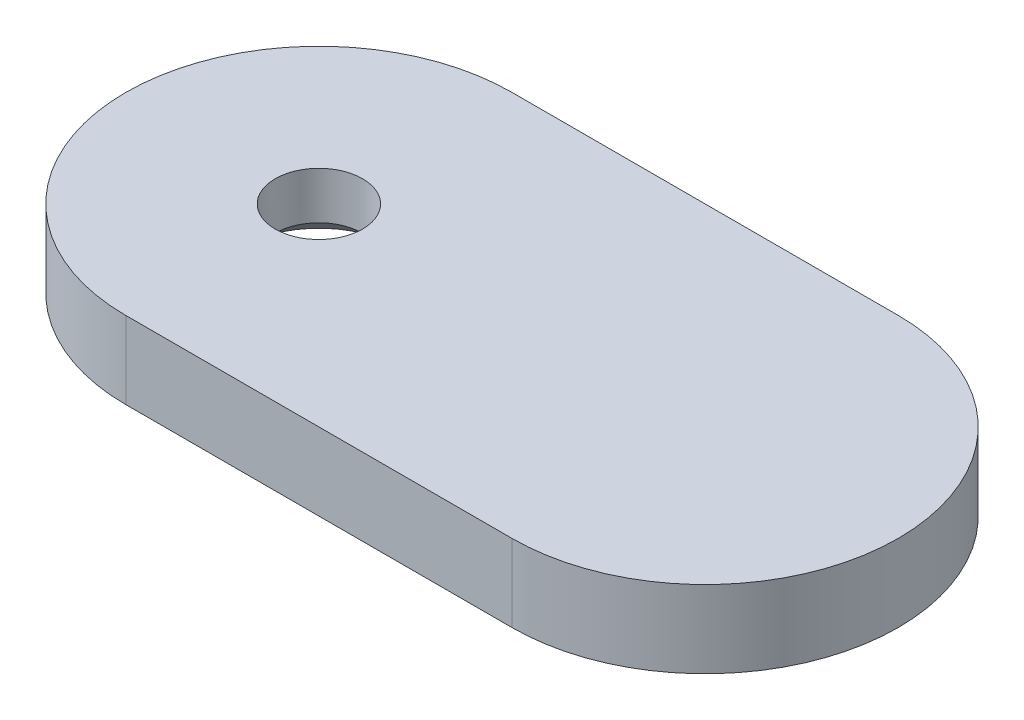
ISO-10303-21;
HEADER;
FILE_DESCRIPTION(('STEP AP214'),'2;1');
FILE_NAME('part.step','',(''),(''),'','','');
FILE_SCHEMA(('AUTOMOTIVE_DESIGN { 1 0 10303 214 1 1 1 1 }'));
ENDSEC;
DATA;
#1=APPLICATION_CONTEXT('core data for automotive mechanical design processes');
#2=APPLICATION_PROTOCOL_DEFINITION('international standard','automotive_design',2000,#1);
#3=PRODUCT_CONTEXT('',#1,'mechanical');
#4=PRODUCT('Part','Part','',(#3));
#5=PRODUCT_RELATED_PRODUCT_CATEGORY('part','',(#4));
#6=PRODUCT_DEFINITION_FORMATION('','',#4);
#7=PRODUCT_DEFINITION_CONTEXT('part definition',#1,'design');
#8=PRODUCT_DEFINITION('design','',#6,#7);
#9=PRODUCT_DEFINITION_SHAPE('','',#8);
#10=(LENGTH_UNIT() NAMED_UNIT(*) SI_UNIT(.MILLI.,.METRE.));
#11=(NAMED_UNIT(*) PLANE_ANGLE_UNIT() SI_UNIT($,.RADIAN.));
#12=(NAMED_UNIT(*) SI_UNIT($,.STERADIAN.) SOLID_ANGLE_UNIT());
#13=UNCERTAINTY_MEASURE_WITH_UNIT(LENGTH_MEASURE(1.E-05),#10,'distance_accuracy_value','');
#14=(GEOMETRIC_REPRESENTATION_CONTEXT(3) GLOBAL_UNCERTAINTY_ASSIGNED_CONTEXT((#13)) GLOBAL_UNIT_ASSIGNED_CONTEXT((#10,
#11,#12)) REPRESENTATION_CONTEXT('',''));
#15=CARTESIAN_POINT('',(0.,0.,0.));
#16=DIRECTION('',(0.,0.,1.));
#17=DIRECTION('',(1.,0.,0.));
#18=AXIS2_PLACEMENT_3D('',#15,#16,#17);
#19=CARTESIAN_POINT('',(-6.92075426384892,2.,0.));
#20=DIRECTION('',(0.,-1.,0.));
#21=DIRECTION('',(0.,0.,-1.));
#22=AXIS2_PLACEMENT_3D('',#19,#20,#21);
#23=CYLINDRICAL_SURFACE('',#22,5.);
#24=CARTESIAN_POINT('',(-6.92075426384892,0.,0.));
#25=DIRECTION('',(0.,1.,0.));
#26=DIRECTION('',(0.,0.,1.));
#27=AXIS2_PLACEMENT_3D('',#24,#25,#26);
#28=CIRCLE('',#27,5.);
#29=CARTESIAN_POINT('',(-6.92075426384892,0.,-5.));
#30=VERTEX_POINT('',#29);
#31=CARTESIAN_POINT('',(-6.92075426384892,0.,5.));
#32=VERTEX_POINT('',#31);
#33=EDGE_CURVE('E102',#30,#32,#28,.T.);
#34=ORIENTED_EDGE('',*,*,#33,.T.);
#35=DIRECTION('',(0.,-1.,0.));
#36=VECTOR('',#35,1.);
#37=CARTESIAN_POINT('',(-6.92075426384892,2.,5.));
#38=LINE('',#37,#36);
#39=CARTESIAN_POINT('',(-6.92075426384892,2.,5.));
#40=VERTEX_POINT('',#39);
#41=EDGE_CURVE('E11',#40,#32,#38,.T.);
#42=ORIENTED_EDGE('',*,*,#41,.F.);
#43=CARTESIAN_POINT('',(-6.92075426384892,2.,0.));
#44=DIRECTION('',(0.,1.,0.));
#45=DIRECTION('',(0.,0.,1.));
#46=AXIS2_PLACEMENT_3D('',#43,#44,#45);
#47=CIRCLE('',#46,5.);
#48=CARTESIAN_POINT('',(-6.92075426384892,2.,-5.));
#49=VERTEX_POINT('',#48);
#50=EDGE_CURVE('E89',#49,#40,#47,.T.);
#51=ORIENTED_EDGE('',*,*,#50,.F.);
#52=DIRECTION('',(0.,-1.,0.));
#53=VECTOR('',#52,1.);
#54=CARTESIAN_POINT('',(-6.92075426384892,2.,-5.));
#55=LINE('',#54,#53);
#56=EDGE_CURVE('E98',#49,#30,#55,.T.);
#57=ORIENTED_EDGE('',*,*,#56,.T.);
#58=EDGE_LOOP('',(#34,#42,#51,#57));
#59=FACE_BOUND('',#58,.T.);
#60=ADVANCED_FACE('F37',(#59),#23,.T.);
#61=CARTESIAN_POINT('',(-6.92075426384892,2.,5.));
#62=DIRECTION('',(0.,0.,-1.));
#63=DIRECTION('',(-1.,0.,0.));
#64=AXIS2_PLACEMENT_3D('',#61,#62,#63);
#65=PLANE('',#64);
#66=DIRECTION('',(1.,0.,0.));
#67=VECTOR('',#66,1.);
#68=CARTESIAN_POINT('',(-6.92075426384892,0.,5.));
#69=LINE('',#68,#67);
#70=CARTESIAN_POINT('',(3.07924573615108,0.,5.));
#71=VERTEX_POINT('',#70);
#72=EDGE_CURVE('E93',#32,#71,#69,.T.);
#73=ORIENTED_EDGE('',*,*,#72,.T.);
#74=DIRECTION('',(0.,-1.,0.));
#75=VECTOR('',#74,1.);
#76=CARTESIAN_POINT('',(3.07924573615108,2.,5.));
#77=LINE('',#76,#75);
#78=CARTESIAN_POINT('',(3.07924573615108,2.,5.));
#79=VERTEX_POINT('',#78);
#80=EDGE_CURVE('E46',#79,#71,#77,.T.);
#81=ORIENTED_EDGE('',*,*,#80,.F.);
#82=DIRECTION('',(1.,0.,0.));
#83=VECTOR('',#82,1.);
#84=CARTESIAN_POINT('',(-6.92075426384892,2.,5.));
#85=LINE('',#84,#83);
#86=EDGE_CURVE('E84',#40,#79,#85,.T.);
#87=ORIENTED_EDGE('',*,*,#86,.F.);
#88=ORIENTED_EDGE('',*,*,#41,.T.);
#89=EDGE_LOOP('',(#73,#81,#87,#88));
#90=FACE_BOUND('',#89,.T.);
#91=ADVANCED_FACE('F92',(#90),#65,.F.);
#92=CARTESIAN_POINT('',(3.07924573615108,2.,0.));
#93=DIRECTION('',(0.,-1.,0.));
#94=DIRECTION('',(0.,0.,-1.));
#95=AXIS2_PLACEMENT_3D('',#92,#93,#94);
#96=CYLINDRICAL_SURFACE('',#95,5.);
#97=CARTESIAN_POINT('',(3.07924573615108,0.,0.));
#98=DIRECTION('',(0.,1.,0.));
#99=DIRECTION('',(0.,0.,1.));
#100=AXIS2_PLACEMENT_3D('',#97,#98,#99);
#101=CIRCLE('',#100,5.);
#102=CARTESIAN_POINT('',(3.07924573615108,0.,-5.));
#103=VERTEX_POINT('',#102);
#104=EDGE_CURVE('E71',#71,#103,#101,.T.);
#105=ORIENTED_EDGE('',*,*,#104,.T.);
#106=DIRECTION('',(0.,-1.,0.));
#107=VECTOR('',#106,1.);
#108=CARTESIAN_POINT('',(3.07924573615108,2.,-5.));
#109=LINE('',#108,#107);
#110=CARTESIAN_POINT('',(3.07924573615108,2.,-5.));
#111=VERTEX_POINT('',#110);
#112=EDGE_CURVE('E94',#111,#103,#109,.T.);
#113=ORIENTED_EDGE('',*,*,#112,.F.);
#114=CARTESIAN_POINT('',(3.07924573615108,2.,0.));
#115=DIRECTION('',(0.,1.,0.));
#116=DIRECTION('',(0.,0.,1.));
#117=AXIS2_PLACEMENT_3D('',#114,#115,#116);
#118=CIRCLE('',#117,5.);
#119=EDGE_CURVE('E87',#79,#111,#118,.T.);
#120=ORIENTED_EDGE('',*,*,#119,.F.);
#121=ORIENTED_EDGE('',*,*,#80,.T.);
#122=EDGE_LOOP('',(#105,#113,#120,#121));
#123=FACE_BOUND('',#122,.T.);
#124=ADVANCED_FACE('F96',(#123),#96,.T.);
#125=CARTESIAN_POINT('',(-6.92075426384892,2.,-5.));
#126=DIRECTION('',(0.,0.,1.));
#127=DIRECTION('',(1.,0.,0.));
#128=AXIS2_PLACEMENT_3D('',#125,#126,#127);
#129=PLANE('',#128);
#130=DIRECTION('',(-1.,0.,0.));
#131=VECTOR('',#130,1.);
#132=CARTESIAN_POINT('',(-6.92075426384892,0.,-5.));
#133=LINE('',#132,#131);
#134=EDGE_CURVE('E77',#103,#30,#133,.T.);
#135=ORIENTED_EDGE('',*,*,#134,.T.);
#136=ORIENTED_EDGE('',*,*,#56,.F.);
#137=DIRECTION('',(-1.,0.,0.));
#138=VECTOR('',#137,1.);
#139=CARTESIAN_POINT('',(-6.92075426384892,2.,-5.));
#140=LINE('',#139,#138);
#141=EDGE_CURVE('E54',#111,#49,#140,.T.);
#142=ORIENTED_EDGE('',*,*,#141,.F.);
#143=ORIENTED_EDGE('',*,*,#112,.T.);
#144=EDGE_LOOP('',(#135,#136,#142,#143));
#145=FACE_BOUND('',#144,.T.);
#146=ADVANCED_FACE('F109',(#145),#129,.F.);
#147=CARTESIAN_POINT('',(-6.92075426384892,2.,0.));
#148=DIRECTION('',(0.,1.,0.));
#149=DIRECTION('',(0.,0.,1.));
#150=AXIS2_PLACEMENT_3D('',#147,#148,#149);
#151=PLANE('',#150);
#152=CARTESIAN_POINT('',(-6.92075426384892,2.,5.27355936696949E-13));
#153=DIRECTION('',(0.,1.,0.));
#154=DIRECTION('',(0.,0.,1.));
#155=AXIS2_PLACEMENT_3D('',#152,#153,#154);
#156=CIRCLE('',#155,1.13029999999999);
#157=CARTESIAN_POINT('',(-6.92075426384892,2.,1.13030000000051));
#158=VERTEX_POINT('',#157);
#159=EDGE_CURVE('E40',#158,#158,#156,.T.);
#160=ORIENTED_EDGE('',*,*,#159,.F.);
#161=EDGE_LOOP('',(#160));
#162=FACE_BOUND('',#161,.T.);
#163=ORIENTED_EDGE('',*,*,#50,.T.);
#164=ORIENTED_EDGE('',*,*,#86,.T.);
#165=ORIENTED_EDGE('',*,*,#119,.T.);
#166=ORIENTED_EDGE('',*,*,#141,.T.);
#167=EDGE_LOOP('',(#163,#164,#165,#166));
#168=FACE_BOUND('',#167,.T.);
#169=ADVANCED_FACE('F85',(#162,#168),#151,.T.);
#170=CARTESIAN_POINT('',(-6.92075426384892,0.,0.));
#171=DIRECTION('',(0.,1.,0.));
#172=DIRECTION('',(0.,0.,1.));
#173=AXIS2_PLACEMENT_3D('',#170,#171,#172);
#174=PLANE('',#173);
#175=CARTESIAN_POINT('',(-6.92075426384892,0.,5.27355936696949E-13));
#176=DIRECTION('',(0.,-1.,0.));
#177=DIRECTION('',(0.,0.,-1.));
#178=AXIS2_PLACEMENT_3D('',#175,#176,#177);
#179=CIRCLE('',#178,2.0574);
#180=CARTESIAN_POINT('',(-6.92075426384892,0.,-2.05739999999947));
#181=VERTEX_POINT('',#180);
#182=EDGE_CURVE('E118',#181,#181,#179,.T.);
#183=ORIENTED_EDGE('',*,*,#182,.F.);
#184=EDGE_LOOP('',(#183));
#185=FACE_BOUND('',#184,.T.);
#186=ORIENTED_EDGE('',*,*,#33,.F.);
#187=ORIENTED_EDGE('',*,*,#134,.F.);
#188=ORIENTED_EDGE('',*,*,#104,.F.);
#189=ORIENTED_EDGE('',*,*,#72,.F.);
#190=EDGE_LOOP('',(#186,#187,#188,#189));
#191=FACE_BOUND('',#190,.T.);
#192=ADVANCED_FACE('F112',(#185,#191),#174,.F.);
#193=CARTESIAN_POINT('',(-6.92075426384892,0.,5.27355936696949E-13));
#194=DIRECTION('',(0.,-1.,0.));
#195=DIRECTION('',(0.,0.,-1.));
#196=AXIS2_PLACEMENT_3D('',#193,#194,#195);
#197=CYLINDRICAL_SURFACE('',#196,1.13029999999999);
#198=ORIENTED_EDGE('',*,*,#159,.T.);
#199=EDGE_LOOP('',(#198));
#200=FACE_BOUND('',#199,.T.);
#201=CARTESIAN_POINT('',(-6.92075426384892,0.77792926806447,5.27355936696949E-13));
#202=DIRECTION('',(0.,-1.,0.));
#203=DIRECTION('',(0.,0.,-1.));
#204=AXIS2_PLACEMENT_3D('',#201,#202,#203);
#205=CIRCLE('',#204,1.13029999999999);
#206=CARTESIAN_POINT('',(-6.92075426384892,0.77792926806447,-1.13029999999946));
#207=VERTEX_POINT('',#206);
#208=EDGE_CURVE('E115',#207,#207,#205,.T.);
#209=ORIENTED_EDGE('',*,*,#208,.T.);
#210=EDGE_LOOP('',(#209));
#211=FACE_BOUND('',#210,.T.);
#212=ADVANCED_FACE('F125',(#200,#211),#197,.F.);
#213=CARTESIAN_POINT('',(-6.92075426384892,0.,5.27355936696949E-13));
#214=DIRECTION('',(0.,-1.,0.));
#215=DIRECTION('',(0.,0.,-1.));
#216=AXIS2_PLACEMENT_3D('',#213,#214,#215);
#217=CONICAL_SURFACE('',#216,2.0574,0.872664625997162);
#218=ORIENTED_EDGE('',*,*,#208,.F.);
#219=EDGE_LOOP('',(#218));
#220=FACE_BOUND('',#219,.T.);
#221=ORIENTED_EDGE('',*,*,#182,.T.);
#222=EDGE_LOOP('',(#221));
#223=FACE_BOUND('',#222,.T.);
#224=ADVANCED_FACE('F122',(#220,#223),#217,.F.);
#225=CLOSED_SHELL('',(#60,#91,#124,#146,#169,#192,#212,#224));
#226=MANIFOLD_SOLID_BREP('B2',#225);
#227=ADVANCED_BREP_SHAPE_REPRESENTATION('',(#18,#226),#14);
#228=SHAPE_DEFINITION_REPRESENTATION(#9,#227);
ENDSEC;
END-ISO-10303-21;
